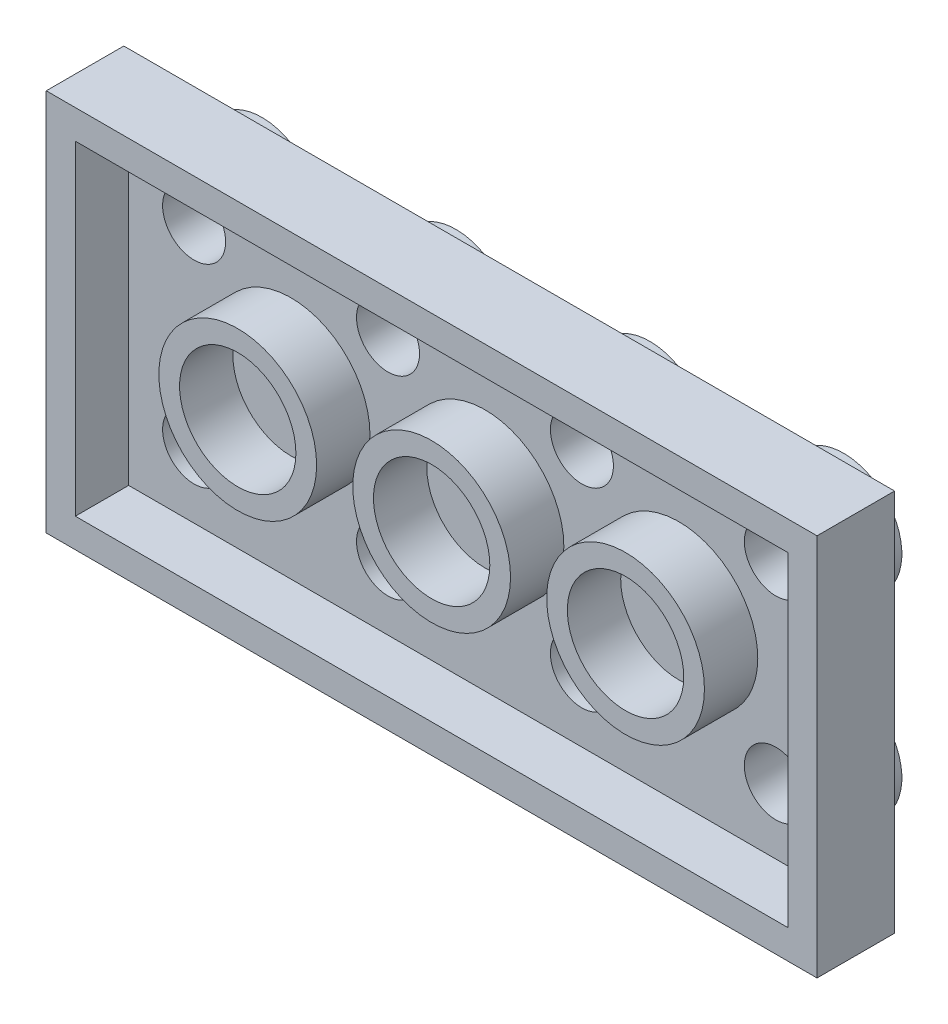
ISO-10303-21;
HEADER;
FILE_DESCRIPTION(('STEP AP214'),'2;1');
FILE_NAME('part.step','',(''),(''),'','','');
FILE_SCHEMA(('AUTOMOTIVE_DESIGN { 1 0 10303 214 1 1 1 1 }'));
ENDSEC;
DATA;
#1=APPLICATION_CONTEXT('core data for automotive mechanical design processes');
#2=APPLICATION_PROTOCOL_DEFINITION('international standard','automotive_design',2000,#1);
#3=PRODUCT_CONTEXT('',#1,'mechanical');
#4=PRODUCT('Part','Part','',(#3));
#5=PRODUCT_RELATED_PRODUCT_CATEGORY('part','',(#4));
#6=PRODUCT_DEFINITION_FORMATION('','',#4);
#7=PRODUCT_DEFINITION_CONTEXT('part definition',#1,'design');
#8=PRODUCT_DEFINITION('design','',#6,#7);
#9=PRODUCT_DEFINITION_SHAPE('','',#8);
#10=(LENGTH_UNIT() NAMED_UNIT(*) SI_UNIT(.MILLI.,.METRE.));
#11=(NAMED_UNIT(*) PLANE_ANGLE_UNIT() SI_UNIT($,.RADIAN.));
#12=(NAMED_UNIT(*) SI_UNIT($,.STERADIAN.) SOLID_ANGLE_UNIT());
#13=UNCERTAINTY_MEASURE_WITH_UNIT(LENGTH_MEASURE(1.E-05),#10,'distance_accuracy_value','');
#14=(GEOMETRIC_REPRESENTATION_CONTEXT(3) GLOBAL_UNCERTAINTY_ASSIGNED_CONTEXT((#13)) GLOBAL_UNIT_ASSIGNED_CONTEXT((#10,
#11,#12)) REPRESENTATION_CONTEXT('',''));
#15=CARTESIAN_POINT('',(0.,0.,0.));
#16=DIRECTION('',(0.,0.,1.));
#17=DIRECTION('',(1.,0.,0.));
#18=AXIS2_PLACEMENT_3D('',#15,#16,#17);
#19=CARTESIAN_POINT('',(0.,-1.2,-3.2));
#20=DIRECTION('',(0.,-1.,0.));
#21=DIRECTION('',(0.,0.,-1.));
#22=AXIS2_PLACEMENT_3D('',#19,#20,#21);
#23=PLANE('',#22);
#24=DIRECTION('',(0.,0.,1.));
#25=VECTOR('',#24,1.);
#26=CARTESIAN_POINT('',(1.2,-1.2,-3.2));
#27=LINE('',#26,#25);
#28=CARTESIAN_POINT('',(1.2,-1.2,-2.2));
#29=VERTEX_POINT('',#28);
#30=CARTESIAN_POINT('',(1.2,-1.2,0.));
#31=VERTEX_POINT('',#30);
#32=EDGE_CURVE('E99',#29,#31,#27,.T.);
#33=ORIENTED_EDGE('',*,*,#32,.F.);
#34=DIRECTION('',(1.,0.,0.));
#35=VECTOR('',#34,1.);
#36=CARTESIAN_POINT('',(30.6,-1.2,-2.2));
#37=LINE('',#36,#35);
#38=CARTESIAN_POINT('',(30.6,-1.2,-2.2));
#39=VERTEX_POINT('',#38);
#40=EDGE_CURVE('E120',#29,#39,#37,.T.);
#41=ORIENTED_EDGE('',*,*,#40,.T.);
#42=DIRECTION('',(0.,0.,1.));
#43=VECTOR('',#42,1.);
#44=CARTESIAN_POINT('',(30.6,-1.2,-3.2));
#45=LINE('',#44,#43);
#46=CARTESIAN_POINT('',(30.6,-1.2,0.));
#47=VERTEX_POINT('',#46);
#48=EDGE_CURVE('E131',#39,#47,#45,.T.);
#49=ORIENTED_EDGE('',*,*,#48,.T.);
#50=DIRECTION('',(1.,0.,0.));
#51=VECTOR('',#50,1.);
#52=CARTESIAN_POINT('',(0.,-1.2,0.));
#53=LINE('',#52,#51);
#54=EDGE_CURVE('E220',#31,#47,#53,.T.);
#55=ORIENTED_EDGE('',*,*,#54,.F.);
#56=EDGE_LOOP('',(#33,#41,#49,#55));
#57=FACE_BOUND('',#56,.T.);
#58=ADVANCED_FACE('F39',(#57),#23,.T.);
#59=CARTESIAN_POINT('',(30.6,0.,-3.2));
#60=DIRECTION('',(-1.,0.,0.));
#61=DIRECTION('',(0.,-1.,0.));
#62=AXIS2_PLACEMENT_3D('',#59,#60,#61);
#63=PLANE('',#62);
#64=ORIENTED_EDGE('',*,*,#48,.F.);
#65=DIRECTION('',(0.,-1.,0.));
#66=VECTOR('',#65,1.);
#67=CARTESIAN_POINT('',(30.6,-1.2,-2.2));
#68=LINE('',#67,#66);
#69=CARTESIAN_POINT('',(30.6,-14.6,-2.2));
#70=VERTEX_POINT('',#69);
#71=EDGE_CURVE('E130',#39,#70,#68,.T.);
#72=ORIENTED_EDGE('',*,*,#71,.T.);
#73=DIRECTION('',(0.,0.,1.));
#74=VECTOR('',#73,1.);
#75=CARTESIAN_POINT('',(30.6,-14.6,-3.2));
#76=LINE('',#75,#74);
#77=CARTESIAN_POINT('',(30.6,-14.6,0.));
#78=VERTEX_POINT('',#77);
#79=EDGE_CURVE('E127',#70,#78,#76,.T.);
#80=ORIENTED_EDGE('',*,*,#79,.T.);
#81=DIRECTION('',(0.,-1.,0.));
#82=VECTOR('',#81,1.);
#83=CARTESIAN_POINT('',(30.6,0.,0.));
#84=LINE('',#83,#82);
#85=EDGE_CURVE('E219',#47,#78,#84,.T.);
#86=ORIENTED_EDGE('',*,*,#85,.F.);
#87=EDGE_LOOP('',(#64,#72,#80,#86));
#88=FACE_BOUND('',#87,.T.);
#89=ADVANCED_FACE('F228',(#88),#63,.T.);
#90=CARTESIAN_POINT('',(1.2,0.,-3.2));
#91=DIRECTION('',(-1.,0.,0.));
#92=DIRECTION('',(0.,-1.,0.));
#93=AXIS2_PLACEMENT_3D('',#90,#91,#92);
#94=PLANE('',#93);
#95=DIRECTION('',(0.,0.,1.));
#96=VECTOR('',#95,1.);
#97=CARTESIAN_POINT('',(1.2,-14.6,-3.2));
#98=LINE('',#97,#96);
#99=CARTESIAN_POINT('',(1.2,-14.6,-2.2));
#100=VERTEX_POINT('',#99);
#101=CARTESIAN_POINT('',(1.2,-14.6,0.));
#102=VERTEX_POINT('',#101);
#103=EDGE_CURVE('E122',#100,#102,#98,.T.);
#104=ORIENTED_EDGE('',*,*,#103,.F.);
#105=DIRECTION('',(0.,1.,0.));
#106=VECTOR('',#105,1.);
#107=CARTESIAN_POINT('',(1.2,-1.2,-2.2));
#108=LINE('',#107,#106);
#109=EDGE_CURVE('E111',#100,#29,#108,.T.);
#110=ORIENTED_EDGE('',*,*,#109,.T.);
#111=ORIENTED_EDGE('',*,*,#32,.T.);
#112=DIRECTION('',(0.,-1.,0.));
#113=VECTOR('',#112,1.);
#114=CARTESIAN_POINT('',(1.2,0.,0.));
#115=LINE('',#114,#113);
#116=EDGE_CURVE('E128',#31,#102,#115,.T.);
#117=ORIENTED_EDGE('',*,*,#116,.T.);
#118=EDGE_LOOP('',(#104,#110,#111,#117));
#119=FACE_BOUND('',#118,.T.);
#120=ADVANCED_FACE('F129',(#119),#94,.F.);
#121=CARTESIAN_POINT('',(0.,-14.6,-3.2));
#122=DIRECTION('',(0.,-1.,0.));
#123=DIRECTION('',(0.,0.,-1.));
#124=AXIS2_PLACEMENT_3D('',#121,#122,#123);
#125=PLANE('',#124);
#126=ORIENTED_EDGE('',*,*,#79,.F.);
#127=DIRECTION('',(-1.,0.,0.));
#128=VECTOR('',#127,1.);
#129=CARTESIAN_POINT('',(30.6,-14.6,-2.2));
#130=LINE('',#129,#128);
#131=EDGE_CURVE('E57',#70,#100,#130,.T.);
#132=ORIENTED_EDGE('',*,*,#131,.T.);
#133=ORIENTED_EDGE('',*,*,#103,.T.);
#134=DIRECTION('',(1.,0.,0.));
#135=VECTOR('',#134,1.);
#136=CARTESIAN_POINT('',(0.,-14.6,0.));
#137=LINE('',#136,#135);
#138=EDGE_CURVE('E224',#102,#78,#137,.T.);
#139=ORIENTED_EDGE('',*,*,#138,.T.);
#140=EDGE_LOOP('',(#126,#132,#133,#139));
#141=FACE_BOUND('',#140,.T.);
#142=ADVANCED_FACE('F125',(#141),#125,.F.);
#143=CARTESIAN_POINT('',(31.8,2.23449950525824E-13,-3.2));
#144=DIRECTION('',(-1.,0.,0.));
#145=DIRECTION('',(0.,-1.,0.));
#146=AXIS2_PLACEMENT_3D('',#143,#144,#145);
#147=PLANE('',#146);
#148=DIRECTION('',(0.,-1.,0.));
#149=VECTOR('',#148,1.);
#150=CARTESIAN_POINT('',(31.8,2.23449950525824E-13,0.));
#151=LINE('',#150,#149);
#152=CARTESIAN_POINT('',(31.8,0.,0.));
#153=VERTEX_POINT('',#152);
#154=CARTESIAN_POINT('',(31.8000000000001,-15.7999999999999,0.));
#155=VERTEX_POINT('',#154);
#156=EDGE_CURVE('E200',#153,#155,#151,.T.);
#157=ORIENTED_EDGE('',*,*,#156,.T.);
#158=DIRECTION('',(0.,0.,1.));
#159=VECTOR('',#158,1.);
#160=CARTESIAN_POINT('',(31.8000000000001,-15.7999999999999,-3.2));
#161=LINE('',#160,#159);
#162=CARTESIAN_POINT('',(31.8000000000001,-15.7999999999999,-3.2));
#163=VERTEX_POINT('',#162);
#164=EDGE_CURVE('E137',#163,#155,#161,.T.);
#165=ORIENTED_EDGE('',*,*,#164,.F.);
#166=DIRECTION('',(0.,-1.,0.));
#167=VECTOR('',#166,1.);
#168=CARTESIAN_POINT('',(31.8,2.23449950525824E-13,-3.2));
#169=LINE('',#168,#167);
#170=CARTESIAN_POINT('',(31.8,0.,-3.2));
#171=VERTEX_POINT('',#170);
#172=EDGE_CURVE('E63',#171,#163,#169,.T.);
#173=ORIENTED_EDGE('',*,*,#172,.F.);
#174=DIRECTION('',(0.,0.,1.));
#175=VECTOR('',#174,1.);
#176=CARTESIAN_POINT('',(31.8,0.,-3.2));
#177=LINE('',#176,#175);
#178=EDGE_CURVE('E144',#171,#153,#177,.T.);
#179=ORIENTED_EDGE('',*,*,#178,.T.);
#180=EDGE_LOOP('',(#157,#165,#173,#179));
#181=FACE_BOUND('',#180,.T.);
#182=ADVANCED_FACE('F41',(#181),#147,.F.);
#183=CARTESIAN_POINT('',(1.46524127562068E-13,-15.8000000000002,-3.2));
#184=DIRECTION('',(0.,-1.,0.));
#185=DIRECTION('',(1.,0.,0.));
#186=AXIS2_PLACEMENT_3D('',#183,#184,#185);
#187=PLANE('',#186);
#188=DIRECTION('',(1.,0.,0.));
#189=VECTOR('',#188,1.);
#190=CARTESIAN_POINT('',(1.46524127562068E-13,-15.8000000000002,0.));
#191=LINE('',#190,#189);
#192=CARTESIAN_POINT('',(1.10330810307444E-13,-15.8000000000002,0.));
#193=VERTEX_POINT('',#192);
#194=EDGE_CURVE('E212',#193,#155,#191,.T.);
#195=ORIENTED_EDGE('',*,*,#194,.F.);
#196=DIRECTION('',(0.,0.,1.));
#197=VECTOR('',#196,1.);
#198=CARTESIAN_POINT('',(1.10330810307444E-13,-15.8000000000002,-3.2));
#199=LINE('',#198,#197);
#200=CARTESIAN_POINT('',(1.10330810307444E-13,-15.8000000000002,-3.2));
#201=VERTEX_POINT('',#200);
#202=EDGE_CURVE('E143',#201,#193,#199,.T.);
#203=ORIENTED_EDGE('',*,*,#202,.F.);
#204=DIRECTION('',(1.,0.,0.));
#205=VECTOR('',#204,1.);
#206=CARTESIAN_POINT('',(1.46524127562068E-13,-15.8000000000002,-3.2));
#207=LINE('',#206,#205);
#208=EDGE_CURVE('E146',#201,#163,#207,.T.);
#209=ORIENTED_EDGE('',*,*,#208,.T.);
#210=ORIENTED_EDGE('',*,*,#164,.T.);
#211=EDGE_LOOP('',(#195,#203,#209,#210));
#212=FACE_BOUND('',#211,.T.);
#213=ADVANCED_FACE('F242',(#212),#187,.T.);
#214=CARTESIAN_POINT('',(0.,0.,-3.2));
#215=DIRECTION('',(-1.,0.,0.));
#216=DIRECTION('',(0.,-1.,0.));
#217=AXIS2_PLACEMENT_3D('',#214,#215,#216);
#218=PLANE('',#217);
#219=DIRECTION('',(0.,-1.,0.));
#220=VECTOR('',#219,1.);
#221=CARTESIAN_POINT('',(0.,0.,0.));
#222=LINE('',#221,#220);
#223=CARTESIAN_POINT('',(0.,0.,0.));
#224=VERTEX_POINT('',#223);
#225=EDGE_CURVE('E211',#224,#193,#222,.T.);
#226=ORIENTED_EDGE('',*,*,#225,.F.);
#227=DIRECTION('',(0.,0.,1.));
#228=VECTOR('',#227,1.);
#229=CARTESIAN_POINT('',(0.,0.,-3.2));
#230=LINE('',#229,#228);
#231=CARTESIAN_POINT('',(0.,0.,-3.2));
#232=VERTEX_POINT('',#231);
#233=EDGE_CURVE('E141',#232,#224,#230,.T.);
#234=ORIENTED_EDGE('',*,*,#233,.F.);
#235=DIRECTION('',(0.,-1.,0.));
#236=VECTOR('',#235,1.);
#237=CARTESIAN_POINT('',(0.,0.,-3.2));
#238=LINE('',#237,#236);
#239=EDGE_CURVE('E205',#232,#201,#238,.T.);
#240=ORIENTED_EDGE('',*,*,#239,.T.);
#241=ORIENTED_EDGE('',*,*,#202,.T.);
#242=EDGE_LOOP('',(#226,#234,#240,#241));
#243=FACE_BOUND('',#242,.T.);
#244=ADVANCED_FACE('F241',(#243),#218,.T.);
#245=CARTESIAN_POINT('',(0.,0.,-3.2));
#246=DIRECTION('',(0.,-1.,0.));
#247=DIRECTION('',(0.,0.,-1.));
#248=AXIS2_PLACEMENT_3D('',#245,#246,#247);
#249=PLANE('',#248);
#250=DIRECTION('',(1.,0.,0.));
#251=VECTOR('',#250,1.);
#252=CARTESIAN_POINT('',(0.,0.,0.));
#253=LINE('',#252,#251);
#254=EDGE_CURVE('E207',#224,#153,#253,.T.);
#255=ORIENTED_EDGE('',*,*,#254,.T.);
#256=ORIENTED_EDGE('',*,*,#178,.F.);
#257=DIRECTION('',(1.,0.,0.));
#258=VECTOR('',#257,1.);
#259=CARTESIAN_POINT('',(0.,0.,-3.2));
#260=LINE('',#259,#258);
#261=EDGE_CURVE('E104',#232,#171,#260,.T.);
#262=ORIENTED_EDGE('',*,*,#261,.F.);
#263=ORIENTED_EDGE('',*,*,#233,.T.);
#264=EDGE_LOOP('',(#255,#256,#262,#263));
#265=FACE_BOUND('',#264,.T.);
#266=ADVANCED_FACE('F250',(#265),#249,.F.);
#267=CARTESIAN_POINT('',(0.,0.,-3.2));
#268=DIRECTION('',(0.,0.,1.));
#269=DIRECTION('',(1.,0.,0.));
#270=AXIS2_PLACEMENT_3D('',#267,#268,#269);
#271=PLANE('',#270);
#272=CARTESIAN_POINT('',(19.8999999979999,-11.9000000000001,-3.2));
#273=DIRECTION('',(0.,0.,-1.));
#274=DIRECTION('',(-1.,0.,0.));
#275=AXIS2_PLACEMENT_3D('',#272,#273,#274);
#276=CIRCLE('',#275,2.39999999941531);
#277=CARTESIAN_POINT('',(17.4999999985846,-11.9000000000001,-3.2));
#278=VERTEX_POINT('',#277);
#279=EDGE_CURVE('E11',#278,#278,#276,.T.);
#280=ORIENTED_EDGE('',*,*,#279,.F.);
#281=EDGE_LOOP('',(#280));
#282=FACE_BOUND('',#281,.T.);
#283=CARTESIAN_POINT('',(3.899999994,-3.89999999999966,-3.2));
#284=DIRECTION('',(0.,0.,-1.));
#285=DIRECTION('',(-1.,0.,0.));
#286=AXIS2_PLACEMENT_3D('',#283,#284,#285);
#287=CIRCLE('',#286,2.4);
#288=CARTESIAN_POINT('',(1.499999994,-3.89999999999966,-3.2));
#289=VERTEX_POINT('',#288);
#290=EDGE_CURVE('E48',#289,#289,#287,.T.);
#291=ORIENTED_EDGE('',*,*,#290,.F.);
#292=EDGE_LOOP('',(#291));
#293=FACE_BOUND('',#292,.T.);
#294=CARTESIAN_POINT('',(11.899999996,-3.89999999999978,-3.2));
#295=DIRECTION('',(0.,0.,-1.));
#296=DIRECTION('',(-1.,0.,0.));
#297=AXIS2_PLACEMENT_3D('',#294,#295,#296);
#298=CIRCLE('',#297,2.4);
#299=CARTESIAN_POINT('',(9.499999996,-3.89999999999978,-3.2));
#300=VERTEX_POINT('',#299);
#301=EDGE_CURVE('E797',#300,#300,#298,.T.);
#302=ORIENTED_EDGE('',*,*,#301,.F.);
#303=EDGE_LOOP('',(#302));
#304=FACE_BOUND('',#303,.T.);
#305=CARTESIAN_POINT('',(19.899999998,-3.89999999999989,-3.2));
#306=DIRECTION('',(0.,0.,-1.));
#307=DIRECTION('',(-1.,0.,0.));
#308=AXIS2_PLACEMENT_3D('',#305,#306,#307);
#309=CIRCLE('',#308,2.4);
#310=CARTESIAN_POINT('',(17.499999998,-3.89999999999989,-3.2));
#311=VERTEX_POINT('',#310);
#312=EDGE_CURVE('E784',#311,#311,#309,.T.);
#313=ORIENTED_EDGE('',*,*,#312,.F.);
#314=EDGE_LOOP('',(#313));
#315=FACE_BOUND('',#314,.T.);
#316=CARTESIAN_POINT('',(11.8999999959999,-11.8999999999999,-3.2));
#317=DIRECTION('',(0.,0.,-1.));
#318=DIRECTION('',(-1.,0.,0.));
#319=AXIS2_PLACEMENT_3D('',#316,#317,#318);
#320=CIRCLE('',#319,2.39999999941531);
#321=CARTESIAN_POINT('',(9.49999999658461,-11.8999999999999,-3.2));
#322=VERTEX_POINT('',#321);
#323=EDGE_CURVE('E785',#322,#322,#320,.T.);
#324=ORIENTED_EDGE('',*,*,#323,.F.);
#325=EDGE_LOOP('',(#324));
#326=FACE_BOUND('',#325,.T.);
#327=CARTESIAN_POINT('',(3.89999999399992,-11.8999999999998,-3.2));
#328=DIRECTION('',(0.,0.,-1.));
#329=DIRECTION('',(-1.,0.,0.));
#330=AXIS2_PLACEMENT_3D('',#327,#328,#329);
#331=CIRCLE('',#330,2.39999999941531);
#332=CARTESIAN_POINT('',(1.49999999458461,-11.8999999999998,-3.2));
#333=VERTEX_POINT('',#332);
#334=EDGE_CURVE('E163',#333,#333,#331,.T.);
#335=ORIENTED_EDGE('',*,*,#334,.F.);
#336=EDGE_LOOP('',(#335));
#337=FACE_BOUND('',#336,.T.);
#338=CARTESIAN_POINT('',(27.8999999999999,-11.9000000000002,-3.2));
#339=DIRECTION('',(0.,0.,-1.));
#340=DIRECTION('',(-1.,0.,0.));
#341=AXIS2_PLACEMENT_3D('',#338,#339,#340);
#342=CIRCLE('',#341,2.39999999941531);
#343=CARTESIAN_POINT('',(25.5000000005846,-11.9000000000002,-3.2));
#344=VERTEX_POINT('',#343);
#345=EDGE_CURVE('E157',#344,#344,#342,.T.);
#346=ORIENTED_EDGE('',*,*,#345,.F.);
#347=EDGE_LOOP('',(#346));
#348=FACE_BOUND('',#347,.T.);
#349=CARTESIAN_POINT('',(27.9,-3.9,-3.2));
#350=DIRECTION('',(0.,0.,-1.));
#351=DIRECTION('',(-1.,0.,0.));
#352=AXIS2_PLACEMENT_3D('',#349,#350,#351);
#353=CIRCLE('',#352,2.4);
#354=CARTESIAN_POINT('',(25.5,-3.9,-3.2));
#355=VERTEX_POINT('',#354);
#356=EDGE_CURVE('E154',#355,#355,#353,.T.);
#357=ORIENTED_EDGE('',*,*,#356,.F.);
#358=EDGE_LOOP('',(#357));
#359=FACE_BOUND('',#358,.T.);
#360=ORIENTED_EDGE('',*,*,#172,.T.);
#361=ORIENTED_EDGE('',*,*,#208,.F.);
#362=ORIENTED_EDGE('',*,*,#239,.F.);
#363=ORIENTED_EDGE('',*,*,#261,.T.);
#364=EDGE_LOOP('',(#360,#361,#362,#363));
#365=FACE_BOUND('',#364,.T.);
#366=ADVANCED_FACE('F249',(#282,#293,#304,#315,#326,#337,#348,#359,#365),#271,.F.);
#367=CARTESIAN_POINT('',(0.,0.,0.));
#368=DIRECTION('',(0.,0.,1.));
#369=DIRECTION('',(1.,0.,0.));
#370=AXIS2_PLACEMENT_3D('',#367,#368,#369);
#371=PLANE('',#370);
#372=ORIENTED_EDGE('',*,*,#156,.F.);
#373=ORIENTED_EDGE('',*,*,#254,.F.);
#374=ORIENTED_EDGE('',*,*,#225,.T.);
#375=ORIENTED_EDGE('',*,*,#194,.T.);
#376=EDGE_LOOP('',(#372,#373,#374,#375));
#377=FACE_BOUND('',#376,.T.);
#378=ORIENTED_EDGE('',*,*,#54,.T.);
#379=ORIENTED_EDGE('',*,*,#85,.T.);
#380=ORIENTED_EDGE('',*,*,#138,.F.);
#381=ORIENTED_EDGE('',*,*,#116,.F.);
#382=EDGE_LOOP('',(#378,#379,#380,#381));
#383=FACE_BOUND('',#382,.T.);
#384=ADVANCED_FACE('F227',(#377,#383),#371,.T.);
#385=CARTESIAN_POINT('',(0.,0.,-2.2));
#386=DIRECTION('',(0.,0.,-1.));
#387=DIRECTION('',(-1.,0.,0.));
#388=AXIS2_PLACEMENT_3D('',#385,#386,#387);
#389=PLANE('',#388);
#390=CARTESIAN_POINT('',(11.8999999960001,-11.9000000019997,-2.2));
#391=DIRECTION('',(0.,0.,1.));
#392=DIRECTION('',(1.,0.,0.));
#393=AXIS2_PLACEMENT_3D('',#390,#391,#392);
#394=CIRCLE('',#393,1.3);
#395=CARTESIAN_POINT('',(13.1999999960001,-11.9000000019997,-2.2));
#396=VERTEX_POINT('',#395);
#397=EDGE_CURVE('E753',#396,#396,#394,.T.);
#398=ORIENTED_EDGE('',*,*,#397,.F.);
#399=EDGE_LOOP('',(#398));
#400=FACE_BOUND('',#399,.T.);
#401=CARTESIAN_POINT('',(27.9,-3.89999999999966,-2.2));
#402=DIRECTION('',(0.,0.,1.));
#403=DIRECTION('',(1.,0.,0.));
#404=AXIS2_PLACEMENT_3D('',#401,#402,#403);
#405=CIRCLE('',#404,1.3);
#406=CARTESIAN_POINT('',(29.2,-3.89999999999966,-2.2));
#407=VERTEX_POINT('',#406);
#408=EDGE_CURVE('E773',#407,#407,#405,.T.);
#409=ORIENTED_EDGE('',*,*,#408,.F.);
#410=EDGE_LOOP('',(#409));
#411=FACE_BOUND('',#410,.T.);
#412=CARTESIAN_POINT('',(19.899999998,-3.89999999999966,-2.2));
#413=DIRECTION('',(0.,0.,1.));
#414=DIRECTION('',(1.,0.,0.));
#415=AXIS2_PLACEMENT_3D('',#412,#413,#414);
#416=CIRCLE('',#415,1.3);
#417=CARTESIAN_POINT('',(21.199999998,-3.89999999999966,-2.2));
#418=VERTEX_POINT('',#417);
#419=EDGE_CURVE('E768',#418,#418,#416,.T.);
#420=ORIENTED_EDGE('',*,*,#419,.F.);
#421=EDGE_LOOP('',(#420));
#422=FACE_BOUND('',#421,.T.);
#423=CARTESIAN_POINT('',(11.899999996,-3.89999999999966,-2.2));
#424=DIRECTION('',(0.,0.,1.));
#425=DIRECTION('',(1.,0.,0.));
#426=AXIS2_PLACEMENT_3D('',#423,#424,#425);
#427=CIRCLE('',#426,1.3);
#428=CARTESIAN_POINT('',(13.199999996,-3.89999999999966,-2.2));
#429=VERTEX_POINT('',#428);
#430=EDGE_CURVE('E765',#429,#429,#427,.T.);
#431=ORIENTED_EDGE('',*,*,#430,.F.);
#432=EDGE_LOOP('',(#431));
#433=FACE_BOUND('',#432,.T.);
#434=CARTESIAN_POINT('',(19.8999999980001,-11.9000000019997,-2.2));
#435=DIRECTION('',(0.,0.,1.));
#436=DIRECTION('',(1.,0.,0.));
#437=AXIS2_PLACEMENT_3D('',#434,#435,#436);
#438=CIRCLE('',#437,1.3);
#439=CARTESIAN_POINT('',(21.1999999980001,-11.9000000019997,-2.2));
#440=VERTEX_POINT('',#439);
#441=EDGE_CURVE('E755',#440,#440,#438,.T.);
#442=ORIENTED_EDGE('',*,*,#441,.F.);
#443=EDGE_LOOP('',(#442));
#444=FACE_BOUND('',#443,.T.);
#445=CARTESIAN_POINT('',(27.9000000000001,-11.9000000019997,-2.2));
#446=DIRECTION('',(0.,0.,1.));
#447=DIRECTION('',(1.,0.,0.));
#448=AXIS2_PLACEMENT_3D('',#445,#446,#447);
#449=CIRCLE('',#448,1.3);
#450=CARTESIAN_POINT('',(29.2000000000001,-11.9000000019997,-2.2));
#451=VERTEX_POINT('',#450);
#452=EDGE_CURVE('E879',#451,#451,#449,.T.);
#453=ORIENTED_EDGE('',*,*,#452,.F.);
#454=EDGE_LOOP('',(#453));
#455=FACE_BOUND('',#454,.T.);
#456=CARTESIAN_POINT('',(3.89999999400008,-11.9000000019997,-2.2));
#457=DIRECTION('',(0.,0.,1.));
#458=DIRECTION('',(1.,0.,0.));
#459=AXIS2_PLACEMENT_3D('',#456,#457,#458);
#460=CIRCLE('',#459,1.3);
#461=CARTESIAN_POINT('',(5.19999999400008,-11.9000000019997,-2.2));
#462=VERTEX_POINT('',#461);
#463=EDGE_CURVE('E872',#462,#462,#460,.T.);
#464=ORIENTED_EDGE('',*,*,#463,.F.);
#465=EDGE_LOOP('',(#464));
#466=FACE_BOUND('',#465,.T.);
#467=CARTESIAN_POINT('',(3.899999994,-3.89999999999966,-2.2));
#468=DIRECTION('',(0.,0.,1.));
#469=DIRECTION('',(1.,0.,0.));
#470=AXIS2_PLACEMENT_3D('',#467,#468,#469);
#471=CIRCLE('',#470,1.3);
#472=CARTESIAN_POINT('',(5.199999994,-3.89999999999966,-2.2));
#473=VERTEX_POINT('',#472);
#474=EDGE_CURVE('E764',#473,#473,#471,.T.);
#475=ORIENTED_EDGE('',*,*,#474,.F.);
#476=EDGE_LOOP('',(#475));
#477=FACE_BOUND('',#476,.T.);
#478=CARTESIAN_POINT('',(23.9000000000001,-7.79999999999983,-2.2));
#479=DIRECTION('',(0.,0.,1.));
#480=DIRECTION('',(1.,0.,0.));
#481=AXIS2_PLACEMENT_3D('',#478,#479,#480);
#482=CIRCLE('',#481,3.2549999999999);
#483=CARTESIAN_POINT('',(27.155,-7.79999999999983,-2.2));
#484=VERTEX_POINT('',#483);
#485=EDGE_CURVE('E168',#484,#484,#482,.T.);
#486=ORIENTED_EDGE('',*,*,#485,.F.);
#487=EDGE_LOOP('',(#486));
#488=FACE_BOUND('',#487,.T.);
#489=CARTESIAN_POINT('',(15.899999998,-7.80000000000005,-2.2));
#490=DIRECTION('',(0.,0.,1.));
#491=DIRECTION('',(1.,0.,0.));
#492=AXIS2_PLACEMENT_3D('',#489,#490,#491);
#493=CIRCLE('',#492,3.255);
#494=CARTESIAN_POINT('',(19.154999998,-7.80000000000005,-2.2));
#495=VERTEX_POINT('',#494);
#496=EDGE_CURVE('E179',#495,#495,#493,.T.);
#497=ORIENTED_EDGE('',*,*,#496,.F.);
#498=EDGE_LOOP('',(#497));
#499=FACE_BOUND('',#498,.T.);
#500=CARTESIAN_POINT('',(7.899999996,-7.80000000000011,-2.2));
#501=DIRECTION('',(0.,0.,1.));
#502=DIRECTION('',(1.,0.,0.));
#503=AXIS2_PLACEMENT_3D('',#500,#501,#502);
#504=CIRCLE('',#503,3.255);
#505=CARTESIAN_POINT('',(11.154999996,-7.80000000000011,-2.2));
#506=VERTEX_POINT('',#505);
#507=EDGE_CURVE('E186',#506,#506,#504,.T.);
#508=ORIENTED_EDGE('',*,*,#507,.F.);
#509=EDGE_LOOP('',(#508));
#510=FACE_BOUND('',#509,.T.);
#511=ORIENTED_EDGE('',*,*,#71,.F.);
#512=ORIENTED_EDGE('',*,*,#40,.F.);
#513=ORIENTED_EDGE('',*,*,#109,.F.);
#514=ORIENTED_EDGE('',*,*,#131,.F.);
#515=EDGE_LOOP('',(#511,#512,#513,#514));
#516=FACE_BOUND('',#515,.T.);
#517=ADVANCED_FACE('F113',(#400,#411,#422,#433,#444,#455,#466,#477,#488,#499,#510,#516),#389,.F.);
#518=CARTESIAN_POINT('',(7.89999999600005,-7.79999999999994,-2.2));
#519=DIRECTION('',(0.,0.,1.));
#520=DIRECTION('',(1.,0.,0.));
#521=AXIS2_PLACEMENT_3D('',#518,#519,#520);
#522=CYLINDRICAL_SURFACE('',#521,2.3999999999999);
#523=CARTESIAN_POINT('',(7.89999999600005,-7.79999999999994,-2.2));
#524=DIRECTION('',(0.,0.,-1.));
#525=DIRECTION('',(-1.,0.,0.));
#526=AXIS2_PLACEMENT_3D('',#523,#524,#525);
#527=CIRCLE('',#526,2.3999999999999);
#528=CARTESIAN_POINT('',(5.49999999600015,-7.79999999999994,-2.2));
#529=VERTEX_POINT('',#528);
#530=EDGE_CURVE('E135',#529,#529,#527,.T.);
#531=ORIENTED_EDGE('',*,*,#530,.T.);
#532=EDGE_LOOP('',(#531));
#533=FACE_BOUND('',#532,.T.);
#534=CARTESIAN_POINT('',(7.89999999600005,-7.79999999999994,0.));
#535=DIRECTION('',(0.,0.,1.));
#536=DIRECTION('',(1.,0.,0.));
#537=AXIS2_PLACEMENT_3D('',#534,#535,#536);
#538=CIRCLE('',#537,2.3999999999999);
#539=CARTESIAN_POINT('',(10.299999996,-7.79999999999994,0.));
#540=VERTEX_POINT('',#539);
#541=EDGE_CURVE('E181',#540,#540,#538,.T.);
#542=ORIENTED_EDGE('',*,*,#541,.T.);
#543=EDGE_LOOP('',(#542));
#544=FACE_BOUND('',#543,.T.);
#545=ADVANCED_FACE('F270',(#533,#544),#522,.F.);
#546=CARTESIAN_POINT('',(7.899999996,-7.80000000000011,-2.2));
#547=DIRECTION('',(0.,0.,1.));
#548=DIRECTION('',(1.,0.,0.));
#549=AXIS2_PLACEMENT_3D('',#546,#547,#548);
#550=CYLINDRICAL_SURFACE('',#549,3.255);
#551=ORIENTED_EDGE('',*,*,#507,.T.);
#552=EDGE_LOOP('',(#551));
#553=FACE_BOUND('',#552,.T.);
#554=CARTESIAN_POINT('',(7.899999996,-7.80000000000011,0.));
#555=DIRECTION('',(0.,0.,1.));
#556=DIRECTION('',(1.,0.,0.));
#557=AXIS2_PLACEMENT_3D('',#554,#555,#556);
#558=CIRCLE('',#557,3.255);
#559=CARTESIAN_POINT('',(11.154999996,-7.80000000000011,0.));
#560=VERTEX_POINT('',#559);
#561=EDGE_CURVE('E195',#560,#560,#558,.T.);
#562=ORIENTED_EDGE('',*,*,#561,.F.);
#563=EDGE_LOOP('',(#562));
#564=FACE_BOUND('',#563,.T.);
#565=ADVANCED_FACE('F330',(#553,#564),#550,.T.);
#566=CARTESIAN_POINT('',(0.,0.,0.));
#567=DIRECTION('',(0.,0.,1.));
#568=DIRECTION('',(1.,0.,0.));
#569=AXIS2_PLACEMENT_3D('',#566,#567,#568);
#570=PLANE('',#569);
#571=ORIENTED_EDGE('',*,*,#541,.F.);
#572=EDGE_LOOP('',(#571));
#573=FACE_BOUND('',#572,.T.);
#574=ORIENTED_EDGE('',*,*,#561,.T.);
#575=EDGE_LOOP('',(#574));
#576=FACE_BOUND('',#575,.T.);
#577=ADVANCED_FACE('F337',(#573,#576),#570,.T.);
#578=ORIENTED_EDGE('',*,*,#530,.F.);
#579=EDGE_LOOP('',(#578));
#580=FACE_BOUND('',#579,.T.);
#581=ADVANCED_FACE('F271',(#580),#389,.F.);
#582=CARTESIAN_POINT('',(15.899999998,-7.80000000000005,-2.2));
#583=DIRECTION('',(0.,0.,1.));
#584=DIRECTION('',(1.,0.,0.));
#585=AXIS2_PLACEMENT_3D('',#582,#583,#584);
#586=CYLINDRICAL_SURFACE('',#585,2.4);
#587=CARTESIAN_POINT('',(15.899999998,-7.80000000000005,-2.2));
#588=DIRECTION('',(0.,0.,-1.));
#589=DIRECTION('',(-1.,0.,0.));
#590=AXIS2_PLACEMENT_3D('',#587,#588,#589);
#591=CIRCLE('',#590,2.4);
#592=CARTESIAN_POINT('',(13.499999998,-7.80000000000005,-2.2));
#593=VERTEX_POINT('',#592);
#594=EDGE_CURVE('E147',#593,#593,#591,.T.);
#595=ORIENTED_EDGE('',*,*,#594,.T.);
#596=EDGE_LOOP('',(#595));
#597=FACE_BOUND('',#596,.T.);
#598=CARTESIAN_POINT('',(15.899999998,-7.80000000000005,0.));
#599=DIRECTION('',(0.,0.,1.));
#600=DIRECTION('',(1.,0.,0.));
#601=AXIS2_PLACEMENT_3D('',#598,#599,#600);
#602=CIRCLE('',#601,2.4);
#603=CARTESIAN_POINT('',(18.299999998,-7.80000000000005,0.));
#604=VERTEX_POINT('',#603);
#605=EDGE_CURVE('E174',#604,#604,#602,.T.);
#606=ORIENTED_EDGE('',*,*,#605,.T.);
#607=EDGE_LOOP('',(#606));
#608=FACE_BOUND('',#607,.T.);
#609=ADVANCED_FACE('F349',(#597,#608),#586,.F.);
#610=CARTESIAN_POINT('',(15.899999998,-7.80000000000005,-2.2));
#611=DIRECTION('',(0.,0.,1.));
#612=DIRECTION('',(1.,0.,0.));
#613=AXIS2_PLACEMENT_3D('',#610,#611,#612);
#614=CYLINDRICAL_SURFACE('',#613,3.255);
#615=ORIENTED_EDGE('',*,*,#496,.T.);
#616=EDGE_LOOP('',(#615));
#617=FACE_BOUND('',#616,.T.);
#618=CARTESIAN_POINT('',(15.899999998,-7.80000000000005,0.));
#619=DIRECTION('',(0.,0.,1.));
#620=DIRECTION('',(1.,0.,0.));
#621=AXIS2_PLACEMENT_3D('',#618,#619,#620);
#622=CIRCLE('',#621,3.255);
#623=CARTESIAN_POINT('',(19.154999998,-7.80000000000005,0.));
#624=VERTEX_POINT('',#623);
#625=EDGE_CURVE('E184',#624,#624,#622,.T.);
#626=ORIENTED_EDGE('',*,*,#625,.F.);
#627=EDGE_LOOP('',(#626));
#628=FACE_BOUND('',#627,.T.);
#629=ADVANCED_FACE('F351',(#617,#628),#614,.T.);
#630=CARTESIAN_POINT('',(0.,0.,0.));
#631=DIRECTION('',(0.,0.,1.));
#632=DIRECTION('',(1.,0.,0.));
#633=AXIS2_PLACEMENT_3D('',#630,#631,#632);
#634=PLANE('',#633);
#635=ORIENTED_EDGE('',*,*,#605,.F.);
#636=EDGE_LOOP('',(#635));
#637=FACE_BOUND('',#636,.T.);
#638=ORIENTED_EDGE('',*,*,#625,.T.);
#639=EDGE_LOOP('',(#638));
#640=FACE_BOUND('',#639,.T.);
#641=ADVANCED_FACE('F362',(#637,#640),#634,.T.);
#642=ORIENTED_EDGE('',*,*,#594,.F.);
#643=EDGE_LOOP('',(#642));
#644=FACE_BOUND('',#643,.T.);
#645=ADVANCED_FACE('F371',(#644),#389,.F.);
#646=CARTESIAN_POINT('',(23.9000000000001,-7.79999999999983,-2.2));
#647=DIRECTION('',(0.,0.,1.));
#648=DIRECTION('',(1.,0.,0.));
#649=AXIS2_PLACEMENT_3D('',#646,#647,#648);
#650=CYLINDRICAL_SURFACE('',#649,3.2549999999999);
#651=ORIENTED_EDGE('',*,*,#485,.T.);
#652=EDGE_LOOP('',(#651));
#653=FACE_BOUND('',#652,.T.);
#654=CARTESIAN_POINT('',(23.9000000000001,-7.79999999999983,0.));
#655=DIRECTION('',(0.,0.,1.));
#656=DIRECTION('',(1.,0.,0.));
#657=AXIS2_PLACEMENT_3D('',#654,#655,#656);
#658=CIRCLE('',#657,3.2549999999999);
#659=CARTESIAN_POINT('',(27.155,-7.79999999999983,0.));
#660=VERTEX_POINT('',#659);
#661=EDGE_CURVE('E173',#660,#660,#658,.T.);
#662=ORIENTED_EDGE('',*,*,#661,.F.);
#663=EDGE_LOOP('',(#662));
#664=FACE_BOUND('',#663,.T.);
#665=ADVANCED_FACE('F376',(#653,#664),#650,.T.);
#666=CARTESIAN_POINT('',(23.9000000000001,-7.79999999999983,-2.2));
#667=DIRECTION('',(0.,0.,1.));
#668=DIRECTION('',(1.,0.,0.));
#669=AXIS2_PLACEMENT_3D('',#666,#667,#668);
#670=CYLINDRICAL_SURFACE('',#669,2.3999999999999);
#671=CARTESIAN_POINT('',(23.9000000000001,-7.79999999999983,-2.2));
#672=DIRECTION('',(0.,0.,-1.));
#673=DIRECTION('',(-1.,0.,0.));
#674=AXIS2_PLACEMENT_3D('',#671,#672,#673);
#675=CIRCLE('',#674,2.3999999999999);
#676=CARTESIAN_POINT('',(21.5000000000002,-7.79999999999983,-2.2));
#677=VERTEX_POINT('',#676);
#678=EDGE_CURVE('E43',#677,#677,#675,.T.);
#679=ORIENTED_EDGE('',*,*,#678,.T.);
#680=EDGE_LOOP('',(#679));
#681=FACE_BOUND('',#680,.T.);
#682=CARTESIAN_POINT('',(23.9000000000001,-7.79999999999983,0.));
#683=DIRECTION('',(0.,0.,1.));
#684=DIRECTION('',(1.,0.,0.));
#685=AXIS2_PLACEMENT_3D('',#682,#683,#684);
#686=CIRCLE('',#685,2.3999999999999);
#687=CARTESIAN_POINT('',(26.3,-7.79999999999983,0.));
#688=VERTEX_POINT('',#687);
#689=EDGE_CURVE('E171',#688,#688,#686,.T.);
#690=ORIENTED_EDGE('',*,*,#689,.T.);
#691=EDGE_LOOP('',(#690));
#692=FACE_BOUND('',#691,.T.);
#693=ADVANCED_FACE('F381',(#681,#692),#670,.F.);
#694=CARTESIAN_POINT('',(0.,0.,0.));
#695=DIRECTION('',(0.,0.,1.));
#696=DIRECTION('',(1.,0.,0.));
#697=AXIS2_PLACEMENT_3D('',#694,#695,#696);
#698=PLANE('',#697);
#699=ORIENTED_EDGE('',*,*,#661,.T.);
#700=EDGE_LOOP('',(#699));
#701=FACE_BOUND('',#700,.T.);
#702=ORIENTED_EDGE('',*,*,#689,.F.);
#703=EDGE_LOOP('',(#702));
#704=FACE_BOUND('',#703,.T.);
#705=ADVANCED_FACE('F386',(#701,#704),#698,.T.);
#706=ORIENTED_EDGE('',*,*,#678,.F.);
#707=EDGE_LOOP('',(#706));
#708=FACE_BOUND('',#707,.T.);
#709=ADVANCED_FACE('F269',(#708),#389,.F.);
#710=CARTESIAN_POINT('',(27.9,-3.9,-5.));
#711=DIRECTION('',(0.,0.,1.));
#712=DIRECTION('',(1.,0.,0.));
#713=AXIS2_PLACEMENT_3D('',#710,#711,#712);
#714=CYLINDRICAL_SURFACE('',#713,2.4);
#715=CARTESIAN_POINT('',(27.9,-3.9,-5.));
#716=DIRECTION('',(0.,0.,-1.));
#717=DIRECTION('',(-1.,0.,0.));
#718=AXIS2_PLACEMENT_3D('',#715,#716,#717);
#719=CIRCLE('',#718,2.4);
#720=CARTESIAN_POINT('',(25.5,-3.9,-5.));
#721=VERTEX_POINT('',#720);
#722=EDGE_CURVE('E169',#721,#721,#719,.T.);
#723=ORIENTED_EDGE('',*,*,#722,.F.);
#724=EDGE_LOOP('',(#723));
#725=FACE_BOUND('',#724,.T.);
#726=ORIENTED_EDGE('',*,*,#356,.T.);
#727=EDGE_LOOP('',(#726));
#728=FACE_BOUND('',#727,.T.);
#729=ADVANCED_FACE('F421',(#725,#728),#714,.T.);
#730=CARTESIAN_POINT('',(27.9,-3.9,-5.));
#731=DIRECTION('',(0.,0.,-1.));
#732=DIRECTION('',(-1.,0.,0.));
#733=AXIS2_PLACEMENT_3D('',#730,#731,#732);
#734=PLANE('',#733);
#735=ORIENTED_EDGE('',*,*,#722,.T.);
#736=EDGE_LOOP('',(#735));
#737=FACE_BOUND('',#736,.T.);
#738=ADVANCED_FACE('F431',(#737),#734,.T.);
#739=CARTESIAN_POINT('',(27.8999999999999,-11.9000000000002,-5.));
#740=DIRECTION('',(0.,0.,1.));
#741=DIRECTION('',(1.,0.,0.));
#742=AXIS2_PLACEMENT_3D('',#739,#740,#741);
#743=CYLINDRICAL_SURFACE('',#742,2.39999999941531);
#744=CARTESIAN_POINT('',(27.8999999999999,-11.9000000000002,-5.));
#745=DIRECTION('',(0.,0.,-1.));
#746=DIRECTION('',(-1.,0.,0.));
#747=AXIS2_PLACEMENT_3D('',#744,#745,#746);
#748=CIRCLE('',#747,2.39999999941531);
#749=CARTESIAN_POINT('',(25.5000000005846,-11.9000000000002,-5.));
#750=VERTEX_POINT('',#749);
#751=EDGE_CURVE('E776',#750,#750,#748,.T.);
#752=ORIENTED_EDGE('',*,*,#751,.F.);
#753=EDGE_LOOP('',(#752));
#754=FACE_BOUND('',#753,.T.);
#755=ORIENTED_EDGE('',*,*,#345,.T.);
#756=EDGE_LOOP('',(#755));
#757=FACE_BOUND('',#756,.T.);
#758=ADVANCED_FACE('F439',(#754,#757),#743,.T.);
#759=CARTESIAN_POINT('',(27.8999999999999,-11.9000000000002,-5.));
#760=DIRECTION('',(0.,0.,-1.));
#761=DIRECTION('',(-1.,0.,0.));
#762=AXIS2_PLACEMENT_3D('',#759,#760,#761);
#763=PLANE('',#762);
#764=ORIENTED_EDGE('',*,*,#751,.T.);
#765=EDGE_LOOP('',(#764));
#766=FACE_BOUND('',#765,.T.);
#767=ADVANCED_FACE('F446',(#766),#763,.T.);
#768=CARTESIAN_POINT('',(3.89999999399992,-11.8999999999998,-5.));
#769=DIRECTION('',(0.,0.,1.));
#770=DIRECTION('',(1.,0.,0.));
#771=AXIS2_PLACEMENT_3D('',#768,#769,#770);
#772=CYLINDRICAL_SURFACE('',#771,2.39999999941531);
#773=CARTESIAN_POINT('',(3.89999999399992,-11.8999999999998,-5.));
#774=DIRECTION('',(0.,0.,-1.));
#775=DIRECTION('',(-1.,0.,0.));
#776=AXIS2_PLACEMENT_3D('',#773,#774,#775);
#777=CIRCLE('',#776,2.39999999941531);
#778=CARTESIAN_POINT('',(1.49999999458461,-11.8999999999998,-5.));
#779=VERTEX_POINT('',#778);
#780=EDGE_CURVE('E788',#779,#779,#777,.T.);
#781=ORIENTED_EDGE('',*,*,#780,.F.);
#782=EDGE_LOOP('',(#781));
#783=FACE_BOUND('',#782,.T.);
#784=ORIENTED_EDGE('',*,*,#334,.T.);
#785=EDGE_LOOP('',(#784));
#786=FACE_BOUND('',#785,.T.);
#787=ADVANCED_FACE('F456',(#783,#786),#772,.T.);
#788=CARTESIAN_POINT('',(3.89999999399992,-11.8999999999998,-5.));
#789=DIRECTION('',(0.,0.,-1.));
#790=DIRECTION('',(-1.,0.,0.));
#791=AXIS2_PLACEMENT_3D('',#788,#789,#790);
#792=PLANE('',#791);
#793=ORIENTED_EDGE('',*,*,#780,.T.);
#794=EDGE_LOOP('',(#793));
#795=FACE_BOUND('',#794,.T.);
#796=ADVANCED_FACE('F470',(#795),#792,.T.);
#797=CARTESIAN_POINT('',(11.8999999959999,-11.8999999999999,-5.));
#798=DIRECTION('',(0.,0.,1.));
#799=DIRECTION('',(1.,0.,0.));
#800=AXIS2_PLACEMENT_3D('',#797,#798,#799);
#801=CYLINDRICAL_SURFACE('',#800,2.39999999941531);
#802=CARTESIAN_POINT('',(11.8999999959999,-11.8999999999999,-5.));
#803=DIRECTION('',(0.,0.,-1.));
#804=DIRECTION('',(-1.,0.,0.));
#805=AXIS2_PLACEMENT_3D('',#802,#803,#804);
#806=CIRCLE('',#805,2.39999999941531);
#807=CARTESIAN_POINT('',(9.49999999658461,-11.8999999999999,-5.));
#808=VERTEX_POINT('',#807);
#809=EDGE_CURVE('E787',#808,#808,#806,.T.);
#810=ORIENTED_EDGE('',*,*,#809,.F.);
#811=EDGE_LOOP('',(#810));
#812=FACE_BOUND('',#811,.T.);
#813=ORIENTED_EDGE('',*,*,#323,.T.);
#814=EDGE_LOOP('',(#813));
#815=FACE_BOUND('',#814,.T.);
#816=ADVANCED_FACE('F478',(#812,#815),#801,.T.);
#817=CARTESIAN_POINT('',(11.8999999959999,-11.8999999999999,-5.));
#818=DIRECTION('',(0.,0.,-1.));
#819=DIRECTION('',(-1.,0.,0.));
#820=AXIS2_PLACEMENT_3D('',#817,#818,#819);
#821=PLANE('',#820);
#822=ORIENTED_EDGE('',*,*,#809,.T.);
#823=EDGE_LOOP('',(#822));
#824=FACE_BOUND('',#823,.T.);
#825=ADVANCED_FACE('F484',(#824),#821,.T.);
#826=CARTESIAN_POINT('',(19.899999998,-3.89999999999989,-5.));
#827=DIRECTION('',(0.,0.,1.));
#828=DIRECTION('',(1.,0.,0.));
#829=AXIS2_PLACEMENT_3D('',#826,#827,#828);
#830=CYLINDRICAL_SURFACE('',#829,2.4);
#831=CARTESIAN_POINT('',(19.899999998,-3.89999999999989,-5.));
#832=DIRECTION('',(0.,0.,-1.));
#833=DIRECTION('',(-1.,0.,0.));
#834=AXIS2_PLACEMENT_3D('',#831,#832,#833);
#835=CIRCLE('',#834,2.4);
#836=CARTESIAN_POINT('',(17.499999998,-3.89999999999989,-5.));
#837=VERTEX_POINT('',#836);
#838=EDGE_CURVE('E806',#837,#837,#835,.T.);
#839=ORIENTED_EDGE('',*,*,#838,.F.);
#840=EDGE_LOOP('',(#839));
#841=FACE_BOUND('',#840,.T.);
#842=ORIENTED_EDGE('',*,*,#312,.T.);
#843=EDGE_LOOP('',(#842));
#844=FACE_BOUND('',#843,.T.);
#845=ADVANCED_FACE('F493',(#841,#844),#830,.T.);
#846=CARTESIAN_POINT('',(19.899999998,-3.89999999999989,-5.));
#847=DIRECTION('',(0.,0.,-1.));
#848=DIRECTION('',(-1.,0.,0.));
#849=AXIS2_PLACEMENT_3D('',#846,#847,#848);
#850=PLANE('',#849);
#851=ORIENTED_EDGE('',*,*,#838,.T.);
#852=EDGE_LOOP('',(#851));
#853=FACE_BOUND('',#852,.T.);
#854=ADVANCED_FACE('F504',(#853),#850,.T.);
#855=CARTESIAN_POINT('',(11.899999996,-3.89999999999978,-5.));
#856=DIRECTION('',(0.,0.,1.));
#857=DIRECTION('',(1.,0.,0.));
#858=AXIS2_PLACEMENT_3D('',#855,#856,#857);
#859=CYLINDRICAL_SURFACE('',#858,2.4);
#860=CARTESIAN_POINT('',(11.899999996,-3.89999999999978,-5.));
#861=DIRECTION('',(0.,0.,-1.));
#862=DIRECTION('',(-1.,0.,0.));
#863=AXIS2_PLACEMENT_3D('',#860,#861,#862);
#864=CIRCLE('',#863,2.4);
#865=CARTESIAN_POINT('',(9.499999996,-3.89999999999978,-5.));
#866=VERTEX_POINT('',#865);
#867=EDGE_CURVE('E802',#866,#866,#864,.T.);
#868=ORIENTED_EDGE('',*,*,#867,.F.);
#869=EDGE_LOOP('',(#868));
#870=FACE_BOUND('',#869,.T.);
#871=ORIENTED_EDGE('',*,*,#301,.T.);
#872=EDGE_LOOP('',(#871));
#873=FACE_BOUND('',#872,.T.);
#874=ADVANCED_FACE('F515',(#870,#873),#859,.T.);
#875=CARTESIAN_POINT('',(11.899999996,-3.89999999999978,-5.));
#876=DIRECTION('',(0.,0.,-1.));
#877=DIRECTION('',(-1.,0.,0.));
#878=AXIS2_PLACEMENT_3D('',#875,#876,#877);
#879=PLANE('',#878);
#880=ORIENTED_EDGE('',*,*,#867,.T.);
#881=EDGE_LOOP('',(#880));
#882=FACE_BOUND('',#881,.T.);
#883=ADVANCED_FACE('F523',(#882),#879,.T.);
#884=CARTESIAN_POINT('',(3.899999994,-3.89999999999966,-5.));
#885=DIRECTION('',(0.,0.,1.));
#886=DIRECTION('',(1.,0.,0.));
#887=AXIS2_PLACEMENT_3D('',#884,#885,#886);
#888=CYLINDRICAL_SURFACE('',#887,2.4);
#889=CARTESIAN_POINT('',(3.899999994,-3.89999999999966,-5.));
#890=DIRECTION('',(0.,0.,-1.));
#891=DIRECTION('',(-1.,0.,0.));
#892=AXIS2_PLACEMENT_3D('',#889,#890,#891);
#893=CIRCLE('',#892,2.4);
#894=CARTESIAN_POINT('',(1.499999994,-3.89999999999966,-5.));
#895=VERTEX_POINT('',#894);
#896=EDGE_CURVE('E799',#895,#895,#893,.T.);
#897=ORIENTED_EDGE('',*,*,#896,.F.);
#898=EDGE_LOOP('',(#897));
#899=FACE_BOUND('',#898,.T.);
#900=ORIENTED_EDGE('',*,*,#290,.T.);
#901=EDGE_LOOP('',(#900));
#902=FACE_BOUND('',#901,.T.);
#903=ADVANCED_FACE('F529',(#899,#902),#888,.T.);
#904=CARTESIAN_POINT('',(3.899999994,-3.89999999999966,-5.));
#905=DIRECTION('',(0.,0.,-1.));
#906=DIRECTION('',(-1.,0.,0.));
#907=AXIS2_PLACEMENT_3D('',#904,#905,#906);
#908=PLANE('',#907);
#909=ORIENTED_EDGE('',*,*,#896,.T.);
#910=EDGE_LOOP('',(#909));
#911=FACE_BOUND('',#910,.T.);
#912=ADVANCED_FACE('F537',(#911),#908,.T.);
#913=CARTESIAN_POINT('',(19.8999999979999,-11.9000000000001,-5.));
#914=DIRECTION('',(0.,0.,1.));
#915=DIRECTION('',(1.,0.,0.));
#916=AXIS2_PLACEMENT_3D('',#913,#914,#915);
#917=CYLINDRICAL_SURFACE('',#916,2.39999999941531);
#918=CARTESIAN_POINT('',(19.8999999979999,-11.9000000000001,-5.));
#919=DIRECTION('',(0.,0.,-1.));
#920=DIRECTION('',(-1.,0.,0.));
#921=AXIS2_PLACEMENT_3D('',#918,#919,#920);
#922=CIRCLE('',#921,2.39999999941531);
#923=CARTESIAN_POINT('',(17.4999999985846,-11.9000000000001,-5.));
#924=VERTEX_POINT('',#923);
#925=EDGE_CURVE('E789',#924,#924,#922,.T.);
#926=ORIENTED_EDGE('',*,*,#925,.F.);
#927=EDGE_LOOP('',(#926));
#928=FACE_BOUND('',#927,.T.);
#929=ORIENTED_EDGE('',*,*,#279,.T.);
#930=EDGE_LOOP('',(#929));
#931=FACE_BOUND('',#930,.T.);
#932=ADVANCED_FACE('F547',(#928,#931),#917,.T.);
#933=CARTESIAN_POINT('',(19.8999999979999,-11.9000000000001,-5.));
#934=DIRECTION('',(0.,0.,-1.));
#935=DIRECTION('',(-1.,0.,0.));
#936=AXIS2_PLACEMENT_3D('',#933,#934,#935);
#937=PLANE('',#936);
#938=ORIENTED_EDGE('',*,*,#925,.T.);
#939=EDGE_LOOP('',(#938));
#940=FACE_BOUND('',#939,.T.);
#941=ADVANCED_FACE('F560',(#940),#937,.T.);
#942=CARTESIAN_POINT('',(3.899999994,-3.89999999999966,-4.));
#943=DIRECTION('',(0.,0.,1.));
#944=DIRECTION('',(1.,0.,0.));
#945=AXIS2_PLACEMENT_3D('',#942,#943,#944);
#946=CYLINDRICAL_SURFACE('',#945,1.3);
#947=CARTESIAN_POINT('',(3.899999994,-3.89999999999966,-4.));
#948=DIRECTION('',(0.,0.,1.));
#949=DIRECTION('',(1.,0.,0.));
#950=AXIS2_PLACEMENT_3D('',#947,#948,#949);
#951=CIRCLE('',#950,1.3);
#952=CARTESIAN_POINT('',(5.199999994,-3.89999999999966,-4.));
#953=VERTEX_POINT('',#952);
#954=EDGE_CURVE('E777',#953,#953,#951,.T.);
#955=ORIENTED_EDGE('',*,*,#954,.F.);
#956=EDGE_LOOP('',(#955));
#957=FACE_BOUND('',#956,.T.);
#958=ORIENTED_EDGE('',*,*,#474,.T.);
#959=EDGE_LOOP('',(#958));
#960=FACE_BOUND('',#959,.T.);
#961=ADVANCED_FACE('F567',(#957,#960),#946,.F.);
#962=CARTESIAN_POINT('',(3.899999994,-3.89999999999966,-4.));
#963=DIRECTION('',(0.,0.,1.));
#964=DIRECTION('',(1.,0.,0.));
#965=AXIS2_PLACEMENT_3D('',#962,#963,#964);
#966=PLANE('',#965);
#967=ORIENTED_EDGE('',*,*,#954,.T.);
#968=EDGE_LOOP('',(#967));
#969=FACE_BOUND('',#968,.T.);
#970=ADVANCED_FACE('F573',(#969),#966,.T.);
#971=CARTESIAN_POINT('',(3.89999999400008,-11.9000000019997,-4.));
#972=DIRECTION('',(0.,0.,1.));
#973=DIRECTION('',(1.,0.,0.));
#974=AXIS2_PLACEMENT_3D('',#971,#972,#973);
#975=CYLINDRICAL_SURFACE('',#974,1.3);
#976=CARTESIAN_POINT('',(3.89999999400008,-11.9000000019997,-4.));
#977=DIRECTION('',(0.,0.,1.));
#978=DIRECTION('',(1.,0.,0.));
#979=AXIS2_PLACEMENT_3D('',#976,#977,#978);
#980=CIRCLE('',#979,1.3);
#981=CARTESIAN_POINT('',(5.19999999400008,-11.9000000019997,-4.));
#982=VERTEX_POINT('',#981);
#983=EDGE_CURVE('E871',#982,#982,#980,.T.);
#984=ORIENTED_EDGE('',*,*,#983,.F.);
#985=EDGE_LOOP('',(#984));
#986=FACE_BOUND('',#985,.T.);
#987=ORIENTED_EDGE('',*,*,#463,.T.);
#988=EDGE_LOOP('',(#987));
#989=FACE_BOUND('',#988,.T.);
#990=ADVANCED_FACE('F585',(#986,#989),#975,.F.);
#991=CARTESIAN_POINT('',(3.89999999400008,-11.9000000019997,-4.));
#992=DIRECTION('',(0.,0.,1.));
#993=DIRECTION('',(1.,0.,0.));
#994=AXIS2_PLACEMENT_3D('',#991,#992,#993);
#995=PLANE('',#994);
#996=ORIENTED_EDGE('',*,*,#983,.T.);
#997=EDGE_LOOP('',(#996));
#998=FACE_BOUND('',#997,.T.);
#999=ADVANCED_FACE('F593',(#998),#995,.T.);
#1000=CARTESIAN_POINT('',(27.9000000000001,-11.9000000019997,-4.));
#1001=DIRECTION('',(0.,0.,1.));
#1002=DIRECTION('',(1.,0.,0.));
#1003=AXIS2_PLACEMENT_3D('',#1000,#1001,#1002);
#1004=CYLINDRICAL_SURFACE('',#1003,1.3);
#1005=CARTESIAN_POINT('',(27.9000000000001,-11.9000000019997,-4.));
#1006=DIRECTION('',(0.,0.,1.));
#1007=DIRECTION('',(1.,0.,0.));
#1008=AXIS2_PLACEMENT_3D('',#1005,#1006,#1007);
#1009=CIRCLE('',#1008,1.3);
#1010=CARTESIAN_POINT('',(29.2000000000001,-11.9000000019997,-4.));
#1011=VERTEX_POINT('',#1010);
#1012=EDGE_CURVE('E880',#1011,#1011,#1009,.T.);
#1013=ORIENTED_EDGE('',*,*,#1012,.F.);
#1014=EDGE_LOOP('',(#1013));
#1015=FACE_BOUND('',#1014,.T.);
#1016=ORIENTED_EDGE('',*,*,#452,.T.);
#1017=EDGE_LOOP('',(#1016));
#1018=FACE_BOUND('',#1017,.T.);
#1019=ADVANCED_FACE('F605',(#1015,#1018),#1004,.F.);
#1020=CARTESIAN_POINT('',(27.9000000000001,-11.9000000019997,-4.));
#1021=DIRECTION('',(0.,0.,1.));
#1022=DIRECTION('',(1.,0.,0.));
#1023=AXIS2_PLACEMENT_3D('',#1020,#1021,#1022);
#1024=PLANE('',#1023);
#1025=ORIENTED_EDGE('',*,*,#1012,.T.);
#1026=EDGE_LOOP('',(#1025));
#1027=FACE_BOUND('',#1026,.T.);
#1028=ADVANCED_FACE('F612',(#1027),#1024,.T.);
#1029=CARTESIAN_POINT('',(19.8999999980001,-11.9000000019997,-4.));
#1030=DIRECTION('',(0.,0.,1.));
#1031=DIRECTION('',(1.,0.,0.));
#1032=AXIS2_PLACEMENT_3D('',#1029,#1030,#1031);
#1033=CYLINDRICAL_SURFACE('',#1032,1.3);
#1034=CARTESIAN_POINT('',(19.8999999980001,-11.9000000019997,-4.));
#1035=DIRECTION('',(0.,0.,1.));
#1036=DIRECTION('',(1.,0.,0.));
#1037=AXIS2_PLACEMENT_3D('',#1034,#1035,#1036);
#1038=CIRCLE('',#1037,1.3);
#1039=CARTESIAN_POINT('',(21.1999999980001,-11.9000000019997,-4.));
#1040=VERTEX_POINT('',#1039);
#1041=EDGE_CURVE('E758',#1040,#1040,#1038,.T.);
#1042=ORIENTED_EDGE('',*,*,#1041,.F.);
#1043=EDGE_LOOP('',(#1042));
#1044=FACE_BOUND('',#1043,.T.);
#1045=ORIENTED_EDGE('',*,*,#441,.T.);
#1046=EDGE_LOOP('',(#1045));
#1047=FACE_BOUND('',#1046,.T.);
#1048=ADVANCED_FACE('F619',(#1044,#1047),#1033,.F.);
#1049=CARTESIAN_POINT('',(19.8999999980001,-11.9000000019997,-4.));
#1050=DIRECTION('',(0.,0.,1.));
#1051=DIRECTION('',(1.,0.,0.));
#1052=AXIS2_PLACEMENT_3D('',#1049,#1050,#1051);
#1053=PLANE('',#1052);
#1054=ORIENTED_EDGE('',*,*,#1041,.T.);
#1055=EDGE_LOOP('',(#1054));
#1056=FACE_BOUND('',#1055,.T.);
#1057=ADVANCED_FACE('F626',(#1056),#1053,.T.);
#1058=CARTESIAN_POINT('',(11.899999996,-3.89999999999966,-4.));
#1059=DIRECTION('',(0.,0.,1.));
#1060=DIRECTION('',(1.,0.,0.));
#1061=AXIS2_PLACEMENT_3D('',#1058,#1059,#1060);
#1062=CYLINDRICAL_SURFACE('',#1061,1.3);
#1063=CARTESIAN_POINT('',(11.899999996,-3.89999999999966,-4.));
#1064=DIRECTION('',(0.,0.,1.));
#1065=DIRECTION('',(1.,0.,0.));
#1066=AXIS2_PLACEMENT_3D('',#1063,#1064,#1065);
#1067=CIRCLE('',#1066,1.3);
#1068=CARTESIAN_POINT('',(13.199999996,-3.89999999999966,-4.));
#1069=VERTEX_POINT('',#1068);
#1070=EDGE_CURVE('E766',#1069,#1069,#1067,.T.);
#1071=ORIENTED_EDGE('',*,*,#1070,.F.);
#1072=EDGE_LOOP('',(#1071));
#1073=FACE_BOUND('',#1072,.T.);
#1074=ORIENTED_EDGE('',*,*,#430,.T.);
#1075=EDGE_LOOP('',(#1074));
#1076=FACE_BOUND('',#1075,.T.);
#1077=ADVANCED_FACE('F636',(#1073,#1076),#1062,.F.);
#1078=CARTESIAN_POINT('',(11.899999996,-3.89999999999966,-4.));
#1079=DIRECTION('',(0.,0.,1.));
#1080=DIRECTION('',(1.,0.,0.));
#1081=AXIS2_PLACEMENT_3D('',#1078,#1079,#1080);
#1082=PLANE('',#1081);
#1083=ORIENTED_EDGE('',*,*,#1070,.T.);
#1084=EDGE_LOOP('',(#1083));
#1085=FACE_BOUND('',#1084,.T.);
#1086=ADVANCED_FACE('F650',(#1085),#1082,.T.);
#1087=CARTESIAN_POINT('',(19.899999998,-3.89999999999966,-4.));
#1088=DIRECTION('',(0.,0.,1.));
#1089=DIRECTION('',(1.,0.,0.));
#1090=AXIS2_PLACEMENT_3D('',#1087,#1088,#1089);
#1091=CYLINDRICAL_SURFACE('',#1090,1.3);
#1092=CARTESIAN_POINT('',(19.899999998,-3.89999999999966,-4.));
#1093=DIRECTION('',(0.,0.,1.));
#1094=DIRECTION('',(1.,0.,0.));
#1095=AXIS2_PLACEMENT_3D('',#1092,#1093,#1094);
#1096=CIRCLE('',#1095,1.3);
#1097=CARTESIAN_POINT('',(21.199999998,-3.89999999999966,-4.));
#1098=VERTEX_POINT('',#1097);
#1099=EDGE_CURVE('E775',#1098,#1098,#1096,.T.);
#1100=ORIENTED_EDGE('',*,*,#1099,.F.);
#1101=EDGE_LOOP('',(#1100));
#1102=FACE_BOUND('',#1101,.T.);
#1103=ORIENTED_EDGE('',*,*,#419,.T.);
#1104=EDGE_LOOP('',(#1103));
#1105=FACE_BOUND('',#1104,.T.);
#1106=ADVANCED_FACE('F656',(#1102,#1105),#1091,.F.);
#1107=CARTESIAN_POINT('',(19.899999998,-3.89999999999966,-4.));
#1108=DIRECTION('',(0.,0.,1.));
#1109=DIRECTION('',(1.,0.,0.));
#1110=AXIS2_PLACEMENT_3D('',#1107,#1108,#1109);
#1111=PLANE('',#1110);
#1112=ORIENTED_EDGE('',*,*,#1099,.T.);
#1113=EDGE_LOOP('',(#1112));
#1114=FACE_BOUND('',#1113,.T.);
#1115=ADVANCED_FACE('F663',(#1114),#1111,.T.);
#1116=CARTESIAN_POINT('',(27.9,-3.89999999999966,-4.));
#1117=DIRECTION('',(0.,0.,1.));
#1118=DIRECTION('',(1.,0.,0.));
#1119=AXIS2_PLACEMENT_3D('',#1116,#1117,#1118);
#1120=CYLINDRICAL_SURFACE('',#1119,1.3);
#1121=CARTESIAN_POINT('',(27.9,-3.89999999999966,-4.));
#1122=DIRECTION('',(0.,0.,1.));
#1123=DIRECTION('',(1.,0.,0.));
#1124=AXIS2_PLACEMENT_3D('',#1121,#1122,#1123);
#1125=CIRCLE('',#1124,1.3);
#1126=CARTESIAN_POINT('',(29.2,-3.89999999999966,-4.));
#1127=VERTEX_POINT('',#1126);
#1128=EDGE_CURVE('E752',#1127,#1127,#1125,.T.);
#1129=ORIENTED_EDGE('',*,*,#1128,.F.);
#1130=EDGE_LOOP('',(#1129));
#1131=FACE_BOUND('',#1130,.T.);
#1132=ORIENTED_EDGE('',*,*,#408,.T.);
#1133=EDGE_LOOP('',(#1132));
#1134=FACE_BOUND('',#1133,.T.);
#1135=ADVANCED_FACE('F672',(#1131,#1134),#1120,.F.);
#1136=CARTESIAN_POINT('',(27.9,-3.89999999999966,-4.));
#1137=DIRECTION('',(0.,0.,1.));
#1138=DIRECTION('',(1.,0.,0.));
#1139=AXIS2_PLACEMENT_3D('',#1136,#1137,#1138);
#1140=PLANE('',#1139);
#1141=ORIENTED_EDGE('',*,*,#1128,.T.);
#1142=EDGE_LOOP('',(#1141));
#1143=FACE_BOUND('',#1142,.T.);
#1144=ADVANCED_FACE('F684',(#1143),#1140,.T.);
#1145=CARTESIAN_POINT('',(11.8999999960001,-11.9000000019997,-4.));
#1146=DIRECTION('',(0.,0.,1.));
#1147=DIRECTION('',(1.,0.,0.));
#1148=AXIS2_PLACEMENT_3D('',#1145,#1146,#1147);
#1149=CYLINDRICAL_SURFACE('',#1148,1.3);
#1150=CARTESIAN_POINT('',(11.8999999960001,-11.9000000019997,-4.));
#1151=DIRECTION('',(0.,0.,1.));
#1152=DIRECTION('',(1.,0.,0.));
#1153=AXIS2_PLACEMENT_3D('',#1150,#1151,#1152);
#1154=CIRCLE('',#1153,1.3);
#1155=CARTESIAN_POINT('',(13.1999999960001,-11.9000000019997,-4.));
#1156=VERTEX_POINT('',#1155);
#1157=EDGE_CURVE('E749',#1156,#1156,#1154,.T.);
#1158=ORIENTED_EDGE('',*,*,#1157,.F.);
#1159=EDGE_LOOP('',(#1158));
#1160=FACE_BOUND('',#1159,.T.);
#1161=ORIENTED_EDGE('',*,*,#397,.T.);
#1162=EDGE_LOOP('',(#1161));
#1163=FACE_BOUND('',#1162,.T.);
#1164=ADVANCED_FACE('F692',(#1160,#1163),#1149,.F.);
#1165=CARTESIAN_POINT('',(11.8999999960001,-11.9000000019997,-4.));
#1166=DIRECTION('',(0.,0.,1.));
#1167=DIRECTION('',(1.,0.,0.));
#1168=AXIS2_PLACEMENT_3D('',#1165,#1166,#1167);
#1169=PLANE('',#1168);
#1170=ORIENTED_EDGE('',*,*,#1157,.T.);
#1171=EDGE_LOOP('',(#1170));
#1172=FACE_BOUND('',#1171,.T.);
#1173=ADVANCED_FACE('F701',(#1172),#1169,.T.);
#1174=CLOSED_SHELL('',(#58,#89,#120,#142,#182,#213,#244,#266,#366,#384,#517,#545,#565,#577,#581,
#609,#629,#641,#645,#665,#693,#705,#709,#729,#738,#758,#767,#787,#796,#816,#825,#845,#854,#874,
#883,#903,#912,#932,#941,#961,#970,#990,#999,#1019,#1028,#1048,#1057,#1077,#1086,#1106,#1115,
#1135,#1144,#1164,#1173));
#1175=MANIFOLD_SOLID_BREP('B2',#1174);
#1176=ADVANCED_BREP_SHAPE_REPRESENTATION('',(#18,#1175),#14);
#1177=SHAPE_DEFINITION_REPRESENTATION(#9,#1176);
ENDSEC;
END-ISO-10303-21;
